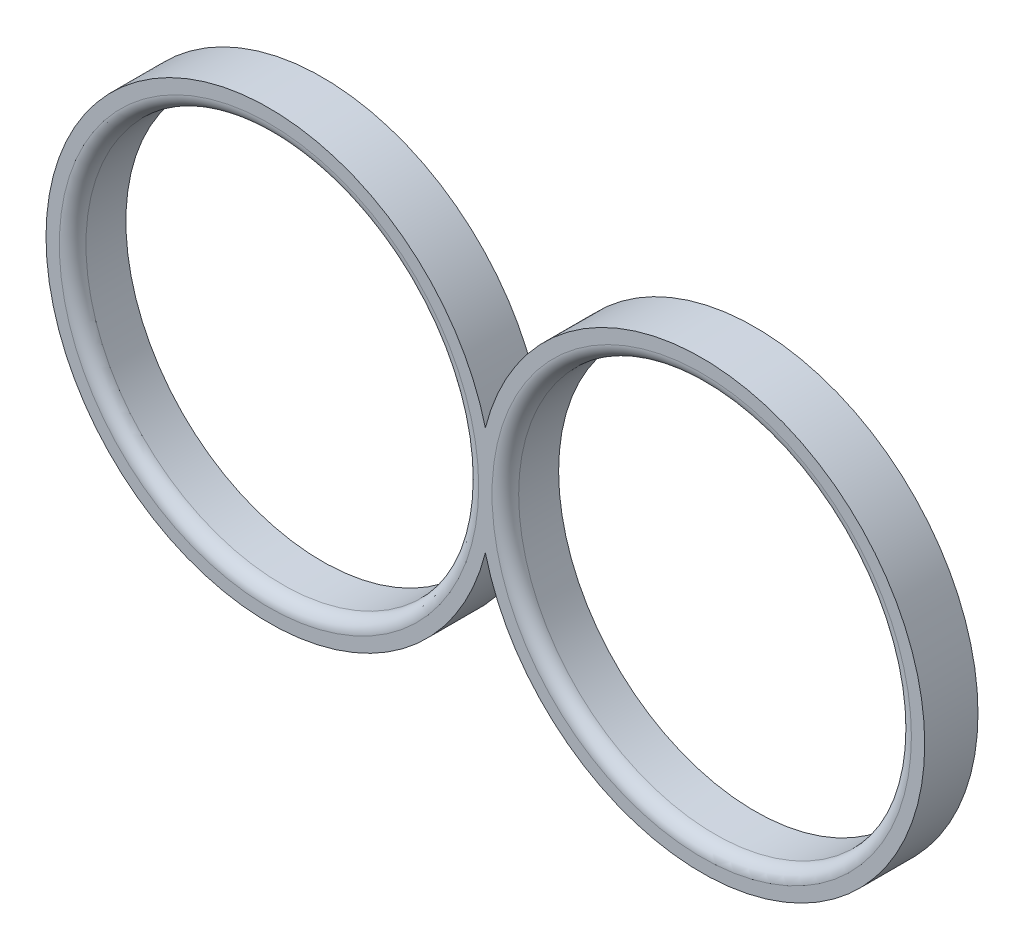
ISO-10303-21;
HEADER;
FILE_DESCRIPTION(('STEP AP214'),'2;1');
FILE_NAME('part.step','',(''),(''),'','','');
FILE_SCHEMA(('AUTOMOTIVE_DESIGN { 1 0 10303 214 1 1 1 1 }'));
ENDSEC;
DATA;
#1=APPLICATION_CONTEXT('core data for automotive mechanical design processes');
#2=APPLICATION_PROTOCOL_DEFINITION('international standard','automotive_design',2000,#1);
#3=PRODUCT_CONTEXT('',#1,'mechanical');
#4=PRODUCT('Part','Part','',(#3));
#5=PRODUCT_RELATED_PRODUCT_CATEGORY('part','',(#4));
#6=PRODUCT_DEFINITION_FORMATION('','',#4);
#7=PRODUCT_DEFINITION_CONTEXT('part definition',#1,'design');
#8=PRODUCT_DEFINITION('design','',#6,#7);
#9=PRODUCT_DEFINITION_SHAPE('','',#8);
#10=(LENGTH_UNIT() NAMED_UNIT(*) SI_UNIT(.MILLI.,.METRE.));
#11=(NAMED_UNIT(*) PLANE_ANGLE_UNIT() SI_UNIT($,.RADIAN.));
#12=(NAMED_UNIT(*) SI_UNIT($,.STERADIAN.) SOLID_ANGLE_UNIT());
#13=UNCERTAINTY_MEASURE_WITH_UNIT(LENGTH_MEASURE(1.E-05),#10,'distance_accuracy_value','');
#14=(GEOMETRIC_REPRESENTATION_CONTEXT(3) GLOBAL_UNCERTAINTY_ASSIGNED_CONTEXT((#13)) GLOBAL_UNIT_ASSIGNED_CONTEXT((#10,
#11,#12)) REPRESENTATION_CONTEXT('',''));
#15=CARTESIAN_POINT('',(0.,0.,0.));
#16=DIRECTION('',(0.,0.,1.));
#17=DIRECTION('',(1.,0.,0.));
#18=AXIS2_PLACEMENT_3D('',#15,#16,#17);
#19=CARTESIAN_POINT('',(0.,0.,4.));
#20=DIRECTION('',(0.,0.,-1.));
#21=DIRECTION('',(-1.,0.,0.));
#22=AXIS2_PLACEMENT_3D('',#19,#20,#21);
#23=CYLINDRICAL_SURFACE('',#22,16.75);
#24=CARTESIAN_POINT('',(0.,0.,0.));
#25=DIRECTION('',(0.,0.,1.));
#26=DIRECTION('',(1.,0.,0.));
#27=AXIS2_PLACEMENT_3D('',#24,#25,#26);
#28=CIRCLE('',#27,16.75);
#29=CARTESIAN_POINT('',(16.25,4.06201920231798,0.));
#30=VERTEX_POINT('',#29);
#31=CARTESIAN_POINT('',(16.25,-4.06201920231798,0.));
#32=VERTEX_POINT('',#31);
#33=EDGE_CURVE('E71',#30,#32,#28,.T.);
#34=ORIENTED_EDGE('',*,*,#33,.T.);
#35=DIRECTION('',(0.,0.,-1.));
#36=VECTOR('',#35,1.);
#37=CARTESIAN_POINT('',(16.25,-4.06201920231798,2.));
#38=LINE('',#37,#36);
#39=CARTESIAN_POINT('',(16.25,-4.06201920231798,4.));
#40=VERTEX_POINT('',#39);
#41=EDGE_CURVE('E59',#32,#40,#38,.F.);
#42=ORIENTED_EDGE('',*,*,#41,.T.);
#43=CARTESIAN_POINT('',(0.,0.,4.));
#44=DIRECTION('',(0.,0.,1.));
#45=DIRECTION('',(1.,0.,0.));
#46=AXIS2_PLACEMENT_3D('',#43,#44,#45);
#47=CIRCLE('',#46,16.75);
#48=CARTESIAN_POINT('',(16.25,4.06201920231798,4.));
#49=VERTEX_POINT('',#48);
#50=EDGE_CURVE('E63',#49,#40,#47,.T.);
#51=ORIENTED_EDGE('',*,*,#50,.F.);
#52=DIRECTION('',(0.,0.,-1.));
#53=VECTOR('',#52,1.);
#54=CARTESIAN_POINT('',(16.25,4.06201920231798,2.));
#55=LINE('',#54,#53);
#56=EDGE_CURVE('E78',#49,#30,#55,.T.);
#57=ORIENTED_EDGE('',*,*,#56,.T.);
#58=EDGE_LOOP('',(#34,#42,#51,#57));
#59=FACE_BOUND('',#58,.T.);
#60=ADVANCED_FACE('F43',(#59),#23,.T.);
#61=CARTESIAN_POINT('',(0.,0.,4.));
#62=DIRECTION('',(0.,0.,1.));
#63=DIRECTION('',(1.,0.,0.));
#64=AXIS2_PLACEMENT_3D('',#61,#62,#63);
#65=PLANE('',#64);
#66=CARTESIAN_POINT('',(32.5,0.,4.));
#67=DIRECTION('',(0.,0.,1.));
#68=DIRECTION('',(1.,0.,0.));
#69=AXIS2_PLACEMENT_3D('',#66,#67,#68);
#70=CIRCLE('',#69,15.75);
#71=CARTESIAN_POINT('',(48.25,0.,4.));
#72=VERTEX_POINT('',#71);
#73=EDGE_CURVE('E11',#72,#72,#70,.F.);
#74=ORIENTED_EDGE('',*,*,#73,.T.);
#75=EDGE_LOOP('',(#74));
#76=FACE_BOUND('',#75,.T.);
#77=CARTESIAN_POINT('',(0.,0.,4.));
#78=DIRECTION('',(0.,0.,1.));
#79=DIRECTION('',(1.,0.,0.));
#80=AXIS2_PLACEMENT_3D('',#77,#78,#79);
#81=CIRCLE('',#80,15.75);
#82=CARTESIAN_POINT('',(15.75,0.,4.));
#83=VERTEX_POINT('',#82);
#84=EDGE_CURVE('E101',#83,#83,#81,.F.);
#85=ORIENTED_EDGE('',*,*,#84,.T.);
#86=EDGE_LOOP('',(#85));
#87=FACE_BOUND('',#86,.T.);
#88=ORIENTED_EDGE('',*,*,#50,.T.);
#89=CARTESIAN_POINT('',(32.5,0.,4.));
#90=DIRECTION('',(0.,0.,-1.));
#91=DIRECTION('',(-1.,0.,0.));
#92=AXIS2_PLACEMENT_3D('',#89,#90,#91);
#93=CIRCLE('',#92,16.75);
#94=EDGE_CURVE('E83',#49,#40,#93,.T.);
#95=ORIENTED_EDGE('',*,*,#94,.F.);
#96=EDGE_LOOP('',(#88,#95));
#97=FACE_BOUND('',#96,.T.);
#98=ADVANCED_FACE('F124',(#76,#87,#97),#65,.T.);
#99=CARTESIAN_POINT('',(0.,0.,0.));
#100=DIRECTION('',(0.,0.,1.));
#101=DIRECTION('',(1.,0.,0.));
#102=AXIS2_PLACEMENT_3D('',#99,#100,#101);
#103=PLANE('',#102);
#104=CARTESIAN_POINT('',(32.5,0.,0.));
#105=DIRECTION('',(0.,0.,-1.));
#106=DIRECTION('',(-1.,0.,0.));
#107=AXIS2_PLACEMENT_3D('',#104,#105,#106);
#108=CIRCLE('',#107,14.75);
#109=CARTESIAN_POINT('',(17.75,0.,0.));
#110=VERTEX_POINT('',#109);
#111=EDGE_CURVE('E87',#110,#110,#108,.T.);
#112=ORIENTED_EDGE('',*,*,#111,.F.);
#113=EDGE_LOOP('',(#112));
#114=FACE_BOUND('',#113,.T.);
#115=CARTESIAN_POINT('',(0.,0.,0.));
#116=DIRECTION('',(0.,0.,1.));
#117=DIRECTION('',(1.,0.,0.));
#118=AXIS2_PLACEMENT_3D('',#115,#116,#117);
#119=CIRCLE('',#118,14.75);
#120=CARTESIAN_POINT('',(14.75,0.,0.));
#121=VERTEX_POINT('',#120);
#122=EDGE_CURVE('E76',#121,#121,#119,.T.);
#123=ORIENTED_EDGE('',*,*,#122,.T.);
#124=EDGE_LOOP('',(#123));
#125=FACE_BOUND('',#124,.T.);
#126=ORIENTED_EDGE('',*,*,#33,.F.);
#127=CARTESIAN_POINT('',(32.5,0.,0.));
#128=DIRECTION('',(0.,0.,-1.));
#129=DIRECTION('',(-1.,0.,0.));
#130=AXIS2_PLACEMENT_3D('',#127,#128,#129);
#131=CIRCLE('',#130,16.75);
#132=EDGE_CURVE('E74',#30,#32,#131,.T.);
#133=ORIENTED_EDGE('',*,*,#132,.T.);
#134=EDGE_LOOP('',(#126,#133));
#135=FACE_BOUND('',#134,.T.);
#136=ADVANCED_FACE('F72',(#114,#125,#135),#103,.F.);
#137=CARTESIAN_POINT('',(0.,0.,20.));
#138=DIRECTION('',(0.,0.,-1.));
#139=DIRECTION('',(-1.,0.,0.));
#140=AXIS2_PLACEMENT_3D('',#137,#138,#139);
#141=CYLINDRICAL_SURFACE('',#140,14.75);
#142=CARTESIAN_POINT('',(0.,0.,3.));
#143=DIRECTION('',(0.,0.,1.));
#144=DIRECTION('',(1.,0.,0.));
#145=AXIS2_PLACEMENT_3D('',#142,#143,#144);
#146=CIRCLE('',#145,14.75);
#147=CARTESIAN_POINT('',(14.75,0.,3.));
#148=VERTEX_POINT('',#147);
#149=EDGE_CURVE('E106',#148,#148,#146,.T.);
#150=ORIENTED_EDGE('',*,*,#149,.T.);
#151=EDGE_LOOP('',(#150));
#152=FACE_BOUND('',#151,.T.);
#153=ORIENTED_EDGE('',*,*,#122,.F.);
#154=EDGE_LOOP('',(#153));
#155=FACE_BOUND('',#154,.T.);
#156=ADVANCED_FACE('F134',(#152,#155),#141,.F.);
#157=CARTESIAN_POINT('',(0.,0.,3.));
#158=DIRECTION('',(0.,0.,1.));
#159=DIRECTION('',(1.,0.,0.));
#160=AXIS2_PLACEMENT_3D('',#157,#158,#159);
#161=TOROIDAL_SURFACE('',#160,15.75,1.);
#162=ORIENTED_EDGE('',*,*,#149,.F.);
#163=EDGE_LOOP('',(#162));
#164=FACE_BOUND('',#163,.T.);
#165=ORIENTED_EDGE('',*,*,#84,.F.);
#166=EDGE_LOOP('',(#165));
#167=FACE_BOUND('',#166,.T.);
#168=ADVANCED_FACE('F132',(#164,#167),#161,.T.);
#169=CARTESIAN_POINT('',(32.5,0.,4.));
#170=DIRECTION('',(0.,0.,-1.));
#171=DIRECTION('',(-1.,0.,0.));
#172=AXIS2_PLACEMENT_3D('',#169,#170,#171);
#173=CYLINDRICAL_SURFACE('',#172,16.75);
#174=ORIENTED_EDGE('',*,*,#41,.F.);
#175=ORIENTED_EDGE('',*,*,#132,.F.);
#176=ORIENTED_EDGE('',*,*,#56,.F.);
#177=ORIENTED_EDGE('',*,*,#94,.T.);
#178=EDGE_LOOP('',(#174,#175,#176,#177));
#179=FACE_BOUND('',#178,.T.);
#180=ADVANCED_FACE('F85',(#179),#173,.T.);
#181=CARTESIAN_POINT('',(32.5,0.,20.));
#182=DIRECTION('',(0.,0.,-1.));
#183=DIRECTION('',(-1.,0.,0.));
#184=AXIS2_PLACEMENT_3D('',#181,#182,#183);
#185=CYLINDRICAL_SURFACE('',#184,14.75);
#186=CARTESIAN_POINT('',(32.5,0.,3.));
#187=DIRECTION('',(0.,0.,1.));
#188=DIRECTION('',(1.,0.,0.));
#189=AXIS2_PLACEMENT_3D('',#186,#187,#188);
#190=CIRCLE('',#189,14.75);
#191=CARTESIAN_POINT('',(47.25,0.,3.));
#192=VERTEX_POINT('',#191);
#193=EDGE_CURVE('E52',#192,#192,#190,.T.);
#194=ORIENTED_EDGE('',*,*,#193,.T.);
#195=EDGE_LOOP('',(#194));
#196=FACE_BOUND('',#195,.T.);
#197=ORIENTED_EDGE('',*,*,#111,.T.);
#198=EDGE_LOOP('',(#197));
#199=FACE_BOUND('',#198,.T.);
#200=ADVANCED_FACE('F113',(#196,#199),#185,.F.);
#201=CARTESIAN_POINT('',(32.5,0.,3.));
#202=DIRECTION('',(0.,0.,1.));
#203=DIRECTION('',(1.,0.,0.));
#204=AXIS2_PLACEMENT_3D('',#201,#202,#203);
#205=TOROIDAL_SURFACE('',#204,15.75,1.);
#206=ORIENTED_EDGE('',*,*,#73,.F.);
#207=EDGE_LOOP('',(#206));
#208=FACE_BOUND('',#207,.T.);
#209=ORIENTED_EDGE('',*,*,#193,.F.);
#210=EDGE_LOOP('',(#209));
#211=FACE_BOUND('',#210,.T.);
#212=ADVANCED_FACE('F45',(#208,#211),#205,.T.);
#213=CLOSED_SHELL('',(#60,#98,#136,#156,#168,#180,#200,#212));
#214=MANIFOLD_SOLID_BREP('B2',#213);
#215=ADVANCED_BREP_SHAPE_REPRESENTATION('',(#18,#214),#14);
#216=SHAPE_DEFINITION_REPRESENTATION(#9,#215);
ENDSEC;
END-ISO-10303-21;
